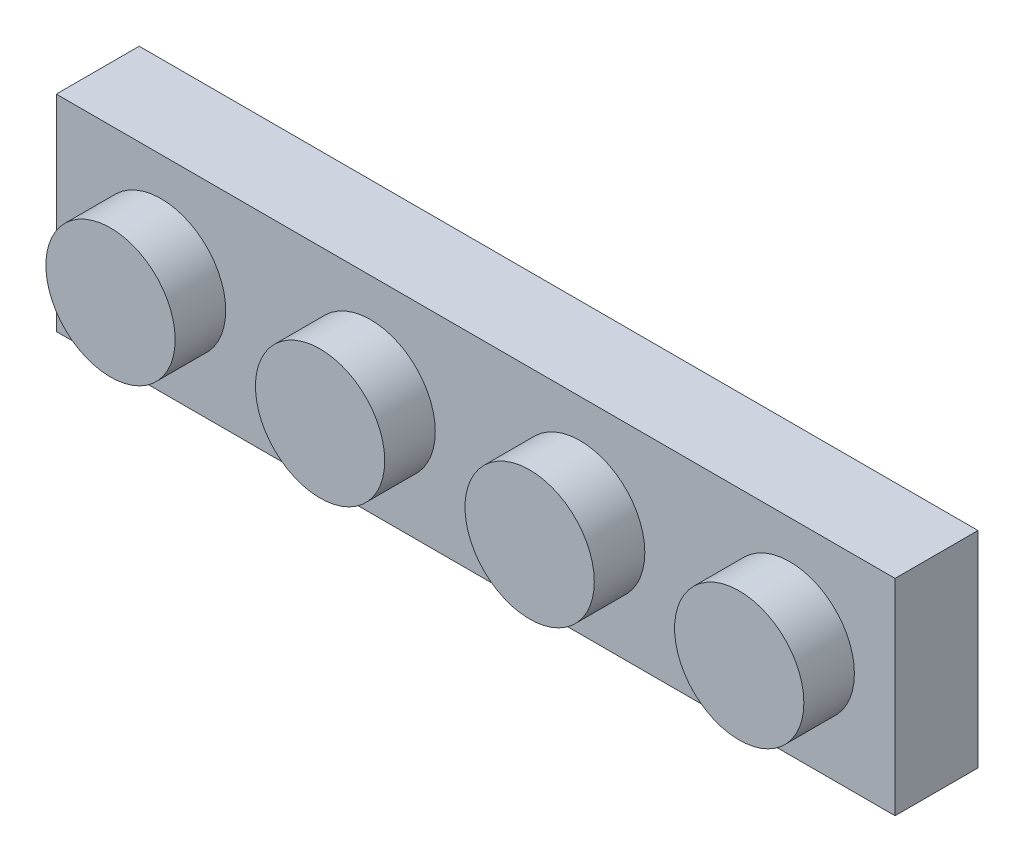
ISO-10303-21;
HEADER;
FILE_DESCRIPTION(('STEP AP214'),'2;1');
FILE_NAME('part.step','',(''),(''),'','','');
FILE_SCHEMA(('AUTOMOTIVE_DESIGN { 1 0 10303 214 1 1 1 1 }'));
ENDSEC;
DATA;
#1=APPLICATION_CONTEXT('core data for automotive mechanical design processes');
#2=APPLICATION_PROTOCOL_DEFINITION('international standard','automotive_design',2000,#1);
#3=PRODUCT_CONTEXT('',#1,'mechanical');
#4=PRODUCT('Part','Part','',(#3));
#5=PRODUCT_RELATED_PRODUCT_CATEGORY('part','',(#4));
#6=PRODUCT_DEFINITION_FORMATION('','',#4);
#7=PRODUCT_DEFINITION_CONTEXT('part definition',#1,'design');
#8=PRODUCT_DEFINITION('design','',#6,#7);
#9=PRODUCT_DEFINITION_SHAPE('','',#8);
#10=(LENGTH_UNIT() NAMED_UNIT(*) SI_UNIT(.MILLI.,.METRE.));
#11=(NAMED_UNIT(*) PLANE_ANGLE_UNIT() SI_UNIT($,.RADIAN.));
#12=(NAMED_UNIT(*) SI_UNIT($,.STERADIAN.) SOLID_ANGLE_UNIT());
#13=UNCERTAINTY_MEASURE_WITH_UNIT(LENGTH_MEASURE(1.E-05),#10,'distance_accuracy_value','');
#14=(GEOMETRIC_REPRESENTATION_CONTEXT(3) GLOBAL_UNCERTAINTY_ASSIGNED_CONTEXT((#13)) GLOBAL_UNIT_ASSIGNED_CONTEXT((#10,
#11,#12)) REPRESENTATION_CONTEXT('',''));
#15=CARTESIAN_POINT('',(0.,0.,0.));
#16=DIRECTION('',(0.,0.,1.));
#17=DIRECTION('',(1.,0.,0.));
#18=AXIS2_PLACEMENT_3D('',#15,#16,#17);
#19=CARTESIAN_POINT('',(15.93,3.905,-3.15));
#20=DIRECTION('',(1.,0.,0.));
#21=DIRECTION('',(0.,0.,-1.));
#22=AXIS2_PLACEMENT_3D('',#19,#20,#21);
#23=PLANE('',#22);
#24=DIRECTION('',(0.,1.,0.));
#25=VECTOR('',#24,1.);
#26=CARTESIAN_POINT('',(15.93,3.905,0.));
#27=LINE('',#26,#25);
#28=CARTESIAN_POINT('',(15.93,-3.905,0.));
#29=VERTEX_POINT('',#28);
#30=CARTESIAN_POINT('',(15.93,3.905,0.));
#31=VERTEX_POINT('',#30);
#32=EDGE_CURVE('E195',#29,#31,#27,.T.);
#33=ORIENTED_EDGE('',*,*,#32,.F.);
#34=DIRECTION('',(0.,0.,1.));
#35=VECTOR('',#34,1.);
#36=CARTESIAN_POINT('',(15.93,-3.905,-3.15));
#37=LINE('',#36,#35);
#38=CARTESIAN_POINT('',(15.93,-3.905,-3.15));
#39=VERTEX_POINT('',#38);
#40=EDGE_CURVE('E58',#39,#29,#37,.T.);
#41=ORIENTED_EDGE('',*,*,#40,.F.);
#42=DIRECTION('',(0.,1.,0.));
#43=VECTOR('',#42,1.);
#44=CARTESIAN_POINT('',(15.93,3.905,-3.15));
#45=LINE('',#44,#43);
#46=CARTESIAN_POINT('',(15.93,3.905,-3.15));
#47=VERTEX_POINT('',#46);
#48=EDGE_CURVE('E198',#39,#47,#45,.T.);
#49=ORIENTED_EDGE('',*,*,#48,.T.);
#50=DIRECTION('',(0.,0.,1.));
#51=VECTOR('',#50,1.);
#52=CARTESIAN_POINT('',(15.93,3.905,-3.15));
#53=LINE('',#52,#51);
#54=EDGE_CURVE('E84',#47,#31,#53,.T.);
#55=ORIENTED_EDGE('',*,*,#54,.T.);
#56=EDGE_LOOP('',(#33,#41,#49,#55));
#57=FACE_BOUND('',#56,.T.);
#58=ADVANCED_FACE('F35',(#57),#23,.T.);
#59=CARTESIAN_POINT('',(-15.93,-3.905,-3.15));
#60=DIRECTION('',(0.,-1.,0.));
#61=DIRECTION('',(0.,0.,-1.));
#62=AXIS2_PLACEMENT_3D('',#59,#60,#61);
#63=PLANE('',#62);
#64=DIRECTION('',(1.,0.,0.));
#65=VECTOR('',#64,1.);
#66=CARTESIAN_POINT('',(-15.93,-3.905,0.));
#67=LINE('',#66,#65);
#68=CARTESIAN_POINT('',(-15.93,-3.905,0.));
#69=VERTEX_POINT('',#68);
#70=EDGE_CURVE('E201',#69,#29,#67,.T.);
#71=ORIENTED_EDGE('',*,*,#70,.F.);
#72=DIRECTION('',(0.,0.,1.));
#73=VECTOR('',#72,1.);
#74=CARTESIAN_POINT('',(-15.93,-3.905,-3.15));
#75=LINE('',#74,#73);
#76=CARTESIAN_POINT('',(-15.93,-3.905,-3.15));
#77=VERTEX_POINT('',#76);
#78=EDGE_CURVE('E220',#77,#69,#75,.T.);
#79=ORIENTED_EDGE('',*,*,#78,.F.);
#80=DIRECTION('',(1.,0.,0.));
#81=VECTOR('',#80,1.);
#82=CARTESIAN_POINT('',(-15.93,-3.905,-3.15));
#83=LINE('',#82,#81);
#84=EDGE_CURVE('E206',#77,#39,#83,.T.);
#85=ORIENTED_EDGE('',*,*,#84,.T.);
#86=ORIENTED_EDGE('',*,*,#40,.T.);
#87=EDGE_LOOP('',(#71,#79,#85,#86));
#88=FACE_BOUND('',#87,.T.);
#89=ADVANCED_FACE('F260',(#88),#63,.T.);
#90=CARTESIAN_POINT('',(-15.93,3.905,-3.15));
#91=DIRECTION('',(-1.,0.,0.));
#92=DIRECTION('',(0.,0.,1.));
#93=AXIS2_PLACEMENT_3D('',#90,#91,#92);
#94=PLANE('',#93);
#95=DIRECTION('',(0.,-1.,0.));
#96=VECTOR('',#95,1.);
#97=CARTESIAN_POINT('',(-15.93,3.905,0.));
#98=LINE('',#97,#96);
#99=CARTESIAN_POINT('',(-15.93,3.905,0.));
#100=VERTEX_POINT('',#99);
#101=EDGE_CURVE('E213',#100,#69,#98,.T.);
#102=ORIENTED_EDGE('',*,*,#101,.F.);
#103=DIRECTION('',(0.,0.,1.));
#104=VECTOR('',#103,1.);
#105=CARTESIAN_POINT('',(-15.93,3.905,-3.15));
#106=LINE('',#105,#104);
#107=CARTESIAN_POINT('',(-15.93,3.905,-3.15));
#108=VERTEX_POINT('',#107);
#109=EDGE_CURVE('E222',#108,#100,#106,.T.);
#110=ORIENTED_EDGE('',*,*,#109,.F.);
#111=DIRECTION('',(0.,-1.,0.));
#112=VECTOR('',#111,1.);
#113=CARTESIAN_POINT('',(-15.93,3.905,-3.15));
#114=LINE('',#113,#112);
#115=EDGE_CURVE('E203',#108,#77,#114,.T.);
#116=ORIENTED_EDGE('',*,*,#115,.T.);
#117=ORIENTED_EDGE('',*,*,#78,.T.);
#118=EDGE_LOOP('',(#102,#110,#116,#117));
#119=FACE_BOUND('',#118,.T.);
#120=ADVANCED_FACE('F264',(#119),#94,.T.);
#121=CARTESIAN_POINT('',(-15.93,3.905,-3.15));
#122=DIRECTION('',(0.,1.,0.));
#123=DIRECTION('',(0.,0.,1.));
#124=AXIS2_PLACEMENT_3D('',#121,#122,#123);
#125=PLANE('',#124);
#126=DIRECTION('',(-1.,0.,0.));
#127=VECTOR('',#126,1.);
#128=CARTESIAN_POINT('',(-15.93,3.905,0.));
#129=LINE('',#128,#127);
#130=EDGE_CURVE('E210',#31,#100,#129,.T.);
#131=ORIENTED_EDGE('',*,*,#130,.F.);
#132=ORIENTED_EDGE('',*,*,#54,.F.);
#133=DIRECTION('',(-1.,0.,0.));
#134=VECTOR('',#133,1.);
#135=CARTESIAN_POINT('',(-15.93,3.905,-3.15));
#136=LINE('',#135,#134);
#137=EDGE_CURVE('E200',#47,#108,#136,.T.);
#138=ORIENTED_EDGE('',*,*,#137,.T.);
#139=ORIENTED_EDGE('',*,*,#109,.T.);
#140=EDGE_LOOP('',(#131,#132,#138,#139));
#141=FACE_BOUND('',#140,.T.);
#142=ADVANCED_FACE('F274',(#141),#125,.T.);
#143=CARTESIAN_POINT('',(0.,0.,-3.15));
#144=DIRECTION('',(0.,0.,1.));
#145=DIRECTION('',(1.,0.,0.));
#146=AXIS2_PLACEMENT_3D('',#143,#144,#145);
#147=PLANE('',#146);
#148=DIRECTION('',(1.,0.,0.));
#149=VECTOR('',#148,1.);
#150=CARTESIAN_POINT('',(0.,-2.405,-3.15));
#151=LINE('',#150,#149);
#152=CARTESIAN_POINT('',(-14.43,-2.405,-3.15));
#153=VERTEX_POINT('',#152);
#154=CARTESIAN_POINT('',(14.43,-2.405,-3.15));
#155=VERTEX_POINT('',#154);
#156=EDGE_CURVE('E169',#153,#155,#151,.T.);
#157=ORIENTED_EDGE('',*,*,#156,.T.);
#158=DIRECTION('',(0.,1.,0.));
#159=VECTOR('',#158,1.);
#160=CARTESIAN_POINT('',(14.43,0.,-3.15));
#161=LINE('',#160,#159);
#162=CARTESIAN_POINT('',(14.43,2.405,-3.15));
#163=VERTEX_POINT('',#162);
#164=EDGE_CURVE('E113',#155,#163,#161,.T.);
#165=ORIENTED_EDGE('',*,*,#164,.T.);
#166=DIRECTION('',(-1.,0.,0.));
#167=VECTOR('',#166,1.);
#168=CARTESIAN_POINT('',(0.,2.405,-3.15));
#169=LINE('',#168,#167);
#170=CARTESIAN_POINT('',(-14.43,2.405,-3.15));
#171=VERTEX_POINT('',#170);
#172=EDGE_CURVE('E135',#163,#171,#169,.T.);
#173=ORIENTED_EDGE('',*,*,#172,.T.);
#174=DIRECTION('',(0.,-1.,0.));
#175=VECTOR('',#174,1.);
#176=CARTESIAN_POINT('',(-14.43,0.,-3.15));
#177=LINE('',#176,#175);
#178=EDGE_CURVE('E49',#171,#153,#177,.T.);
#179=ORIENTED_EDGE('',*,*,#178,.T.);
#180=EDGE_LOOP('',(#157,#165,#173,#179));
#181=FACE_BOUND('',#180,.T.);
#182=ORIENTED_EDGE('',*,*,#48,.F.);
#183=ORIENTED_EDGE('',*,*,#84,.F.);
#184=ORIENTED_EDGE('',*,*,#115,.F.);
#185=ORIENTED_EDGE('',*,*,#137,.F.);
#186=EDGE_LOOP('',(#182,#183,#184,#185));
#187=FACE_BOUND('',#186,.T.);
#188=ADVANCED_FACE('F273',(#181,#187),#147,.F.);
#189=CARTESIAN_POINT('',(0.,0.,0.));
#190=DIRECTION('',(0.,0.,1.));
#191=DIRECTION('',(1.,0.,0.));
#192=AXIS2_PLACEMENT_3D('',#189,#190,#191);
#193=PLANE('',#192);
#194=CARTESIAN_POINT('',(11.93,0.,0.));
#195=DIRECTION('',(0.,0.,1.));
#196=DIRECTION('',(1.,0.,0.));
#197=AXIS2_PLACEMENT_3D('',#194,#195,#196);
#198=CIRCLE('',#197,2.455);
#199=CARTESIAN_POINT('',(14.385,0.,0.));
#200=VERTEX_POINT('',#199);
#201=EDGE_CURVE('E118',#200,#200,#198,.T.);
#202=ORIENTED_EDGE('',*,*,#201,.F.);
#203=EDGE_LOOP('',(#202));
#204=FACE_BOUND('',#203,.T.);
#205=CARTESIAN_POINT('',(3.97,0.,0.));
#206=DIRECTION('',(0.,0.,1.));
#207=DIRECTION('',(1.,0.,0.));
#208=AXIS2_PLACEMENT_3D('',#205,#206,#207);
#209=CIRCLE('',#208,2.455);
#210=CARTESIAN_POINT('',(6.425,0.,0.));
#211=VERTEX_POINT('',#210);
#212=EDGE_CURVE('E177',#211,#211,#209,.T.);
#213=ORIENTED_EDGE('',*,*,#212,.F.);
#214=EDGE_LOOP('',(#213));
#215=FACE_BOUND('',#214,.T.);
#216=CARTESIAN_POINT('',(-3.99,0.,0.));
#217=DIRECTION('',(0.,0.,1.));
#218=DIRECTION('',(1.,0.,0.));
#219=AXIS2_PLACEMENT_3D('',#216,#217,#218);
#220=CIRCLE('',#219,2.455);
#221=CARTESIAN_POINT('',(-1.535,0.,0.));
#222=VERTEX_POINT('',#221);
#223=EDGE_CURVE('E183',#222,#222,#220,.T.);
#224=ORIENTED_EDGE('',*,*,#223,.F.);
#225=EDGE_LOOP('',(#224));
#226=FACE_BOUND('',#225,.T.);
#227=CARTESIAN_POINT('',(-11.95,0.,0.));
#228=DIRECTION('',(0.,0.,1.));
#229=DIRECTION('',(1.,0.,0.));
#230=AXIS2_PLACEMENT_3D('',#227,#228,#229);
#231=CIRCLE('',#230,2.455);
#232=CARTESIAN_POINT('',(-9.495,0.,0.));
#233=VERTEX_POINT('',#232);
#234=EDGE_CURVE('E189',#233,#233,#231,.T.);
#235=ORIENTED_EDGE('',*,*,#234,.F.);
#236=EDGE_LOOP('',(#235));
#237=FACE_BOUND('',#236,.T.);
#238=ORIENTED_EDGE('',*,*,#32,.T.);
#239=ORIENTED_EDGE('',*,*,#130,.T.);
#240=ORIENTED_EDGE('',*,*,#101,.T.);
#241=ORIENTED_EDGE('',*,*,#70,.T.);
#242=EDGE_LOOP('',(#238,#239,#240,#241));
#243=FACE_BOUND('',#242,.T.);
#244=ADVANCED_FACE('F267',(#204,#215,#226,#237,#243),#193,.T.);
#245=CARTESIAN_POINT('',(-11.95,0.,1.92));
#246=DIRECTION('',(0.,0.,-1.));
#247=DIRECTION('',(-1.,0.,0.));
#248=AXIS2_PLACEMENT_3D('',#245,#246,#247);
#249=CYLINDRICAL_SURFACE('',#248,2.455);
#250=CARTESIAN_POINT('',(-11.95,0.,1.92));
#251=DIRECTION('',(0.,0.,1.));
#252=DIRECTION('',(1.,0.,0.));
#253=AXIS2_PLACEMENT_3D('',#250,#251,#252);
#254=CIRCLE('',#253,2.455);
#255=CARTESIAN_POINT('',(-9.495,0.,1.92));
#256=VERTEX_POINT('',#255);
#257=EDGE_CURVE('E192',#256,#256,#254,.T.);
#258=ORIENTED_EDGE('',*,*,#257,.F.);
#259=EDGE_LOOP('',(#258));
#260=FACE_BOUND('',#259,.T.);
#261=ORIENTED_EDGE('',*,*,#234,.T.);
#262=EDGE_LOOP('',(#261));
#263=FACE_BOUND('',#262,.T.);
#264=ADVANCED_FACE('F285',(#260,#263),#249,.T.);
#265=CARTESIAN_POINT('',(-11.95,0.,1.92));
#266=DIRECTION('',(0.,0.,1.));
#267=DIRECTION('',(1.,0.,0.));
#268=AXIS2_PLACEMENT_3D('',#265,#266,#267);
#269=PLANE('',#268);
#270=ORIENTED_EDGE('',*,*,#257,.T.);
#271=EDGE_LOOP('',(#270));
#272=FACE_BOUND('',#271,.T.);
#273=ADVANCED_FACE('F290',(#272),#269,.T.);
#274=CARTESIAN_POINT('',(-3.99,0.,1.92));
#275=DIRECTION('',(0.,0.,-1.));
#276=DIRECTION('',(-1.,0.,0.));
#277=AXIS2_PLACEMENT_3D('',#274,#275,#276);
#278=CYLINDRICAL_SURFACE('',#277,2.455);
#279=CARTESIAN_POINT('',(-3.99,0.,1.92));
#280=DIRECTION('',(0.,0.,1.));
#281=DIRECTION('',(1.,0.,0.));
#282=AXIS2_PLACEMENT_3D('',#279,#280,#281);
#283=CIRCLE('',#282,2.455);
#284=CARTESIAN_POINT('',(-1.535,0.,1.92));
#285=VERTEX_POINT('',#284);
#286=EDGE_CURVE('E186',#285,#285,#283,.T.);
#287=ORIENTED_EDGE('',*,*,#286,.F.);
#288=EDGE_LOOP('',(#287));
#289=FACE_BOUND('',#288,.T.);
#290=ORIENTED_EDGE('',*,*,#223,.T.);
#291=EDGE_LOOP('',(#290));
#292=FACE_BOUND('',#291,.T.);
#293=ADVANCED_FACE('F294',(#289,#292),#278,.T.);
#294=CARTESIAN_POINT('',(-3.99,0.,1.92));
#295=DIRECTION('',(0.,0.,1.));
#296=DIRECTION('',(1.,0.,0.));
#297=AXIS2_PLACEMENT_3D('',#294,#295,#296);
#298=PLANE('',#297);
#299=ORIENTED_EDGE('',*,*,#286,.T.);
#300=EDGE_LOOP('',(#299));
#301=FACE_BOUND('',#300,.T.);
#302=ADVANCED_FACE('F298',(#301),#298,.T.);
#303=CARTESIAN_POINT('',(3.97,0.,1.92));
#304=DIRECTION('',(0.,0.,-1.));
#305=DIRECTION('',(-1.,0.,0.));
#306=AXIS2_PLACEMENT_3D('',#303,#304,#305);
#307=CYLINDRICAL_SURFACE('',#306,2.455);
#308=CARTESIAN_POINT('',(3.97,0.,1.92));
#309=DIRECTION('',(0.,0.,1.));
#310=DIRECTION('',(1.,0.,0.));
#311=AXIS2_PLACEMENT_3D('',#308,#309,#310);
#312=CIRCLE('',#311,2.455);
#313=CARTESIAN_POINT('',(6.425,0.,1.92));
#314=VERTEX_POINT('',#313);
#315=EDGE_CURVE('E180',#314,#314,#312,.T.);
#316=ORIENTED_EDGE('',*,*,#315,.F.);
#317=EDGE_LOOP('',(#316));
#318=FACE_BOUND('',#317,.T.);
#319=ORIENTED_EDGE('',*,*,#212,.T.);
#320=EDGE_LOOP('',(#319));
#321=FACE_BOUND('',#320,.T.);
#322=ADVANCED_FACE('F302',(#318,#321),#307,.T.);
#323=CARTESIAN_POINT('',(3.97,0.,1.92));
#324=DIRECTION('',(0.,0.,1.));
#325=DIRECTION('',(1.,0.,0.));
#326=AXIS2_PLACEMENT_3D('',#323,#324,#325);
#327=PLANE('',#326);
#328=ORIENTED_EDGE('',*,*,#315,.T.);
#329=EDGE_LOOP('',(#328));
#330=FACE_BOUND('',#329,.T.);
#331=ADVANCED_FACE('F306',(#330),#327,.T.);
#332=CARTESIAN_POINT('',(11.93,0.,1.92));
#333=DIRECTION('',(0.,0.,-1.));
#334=DIRECTION('',(-1.,0.,0.));
#335=AXIS2_PLACEMENT_3D('',#332,#333,#334);
#336=CYLINDRICAL_SURFACE('',#335,2.455);
#337=CARTESIAN_POINT('',(11.93,0.,1.92));
#338=DIRECTION('',(0.,0.,1.));
#339=DIRECTION('',(1.,0.,0.));
#340=AXIS2_PLACEMENT_3D('',#337,#338,#339);
#341=CIRCLE('',#340,2.455);
#342=CARTESIAN_POINT('',(14.385,0.,1.92));
#343=VERTEX_POINT('',#342);
#344=EDGE_CURVE('E174',#343,#343,#341,.T.);
#345=ORIENTED_EDGE('',*,*,#344,.F.);
#346=EDGE_LOOP('',(#345));
#347=FACE_BOUND('',#346,.T.);
#348=ORIENTED_EDGE('',*,*,#201,.T.);
#349=EDGE_LOOP('',(#348));
#350=FACE_BOUND('',#349,.T.);
#351=ADVANCED_FACE('F310',(#347,#350),#336,.T.);
#352=CARTESIAN_POINT('',(11.93,0.,1.92));
#353=DIRECTION('',(0.,0.,1.));
#354=DIRECTION('',(1.,0.,0.));
#355=AXIS2_PLACEMENT_3D('',#352,#353,#354);
#356=PLANE('',#355);
#357=ORIENTED_EDGE('',*,*,#344,.T.);
#358=EDGE_LOOP('',(#357));
#359=FACE_BOUND('',#358,.T.);
#360=ADVANCED_FACE('F314',(#359),#356,.T.);
#361=CARTESIAN_POINT('',(14.43,3.905,-3.15));
#362=DIRECTION('',(1.,0.,0.));
#363=DIRECTION('',(0.,0.,-1.));
#364=AXIS2_PLACEMENT_3D('',#361,#362,#363);
#365=PLANE('',#364);
#366=DIRECTION('',(0.,1.,0.));
#367=VECTOR('',#366,1.);
#368=CARTESIAN_POINT('',(14.43,0.,-1.5));
#369=LINE('',#368,#367);
#370=CARTESIAN_POINT('',(14.43,-2.405,-1.5));
#371=VERTEX_POINT('',#370);
#372=CARTESIAN_POINT('',(14.43,2.405,-1.5));
#373=VERTEX_POINT('',#372);
#374=EDGE_CURVE('E111',#371,#373,#369,.T.);
#375=ORIENTED_EDGE('',*,*,#374,.T.);
#376=DIRECTION('',(0.,0.,1.));
#377=VECTOR('',#376,1.);
#378=CARTESIAN_POINT('',(14.43,2.405,-3.15));
#379=LINE('',#378,#377);
#380=EDGE_CURVE('E140',#163,#373,#379,.T.);
#381=ORIENTED_EDGE('',*,*,#380,.F.);
#382=ORIENTED_EDGE('',*,*,#164,.F.);
#383=DIRECTION('',(0.,0.,1.));
#384=VECTOR('',#383,1.);
#385=CARTESIAN_POINT('',(14.43,-2.405,-3.15));
#386=LINE('',#385,#384);
#387=EDGE_CURVE('E108',#155,#371,#386,.T.);
#388=ORIENTED_EDGE('',*,*,#387,.T.);
#389=EDGE_LOOP('',(#375,#381,#382,#388));
#390=FACE_BOUND('',#389,.T.);
#391=ADVANCED_FACE('F110',(#390),#365,.F.);
#392=CARTESIAN_POINT('',(-15.93,-2.405,-3.15));
#393=DIRECTION('',(0.,-1.,0.));
#394=DIRECTION('',(0.,0.,-1.));
#395=AXIS2_PLACEMENT_3D('',#392,#393,#394);
#396=PLANE('',#395);
#397=DIRECTION('',(1.,0.,0.));
#398=VECTOR('',#397,1.);
#399=CARTESIAN_POINT('',(0.,-2.405,-1.5));
#400=LINE('',#399,#398);
#401=CARTESIAN_POINT('',(-14.43,-2.405,-1.5));
#402=VERTEX_POINT('',#401);
#403=EDGE_CURVE('E126',#402,#371,#400,.T.);
#404=ORIENTED_EDGE('',*,*,#403,.T.);
#405=ORIENTED_EDGE('',*,*,#387,.F.);
#406=ORIENTED_EDGE('',*,*,#156,.F.);
#407=DIRECTION('',(0.,0.,1.));
#408=VECTOR('',#407,1.);
#409=CARTESIAN_POINT('',(-14.43,-2.405,-3.15));
#410=LINE('',#409,#408);
#411=EDGE_CURVE('E119',#153,#402,#410,.T.);
#412=ORIENTED_EDGE('',*,*,#411,.T.);
#413=EDGE_LOOP('',(#404,#405,#406,#412));
#414=FACE_BOUND('',#413,.T.);
#415=ADVANCED_FACE('F131',(#414),#396,.F.);
#416=CARTESIAN_POINT('',(-14.43,3.905,-3.15));
#417=DIRECTION('',(-1.,0.,0.));
#418=DIRECTION('',(0.,0.,1.));
#419=AXIS2_PLACEMENT_3D('',#416,#417,#418);
#420=PLANE('',#419);
#421=DIRECTION('',(0.,-1.,0.));
#422=VECTOR('',#421,1.);
#423=CARTESIAN_POINT('',(-14.43,0.,-1.5));
#424=LINE('',#423,#422);
#425=CARTESIAN_POINT('',(-14.43,2.405,-1.5));
#426=VERTEX_POINT('',#425);
#427=EDGE_CURVE('E133',#426,#402,#424,.T.);
#428=ORIENTED_EDGE('',*,*,#427,.T.);
#429=ORIENTED_EDGE('',*,*,#411,.F.);
#430=ORIENTED_EDGE('',*,*,#178,.F.);
#431=DIRECTION('',(0.,0.,1.));
#432=VECTOR('',#431,1.);
#433=CARTESIAN_POINT('',(-14.43,2.405,-3.15));
#434=LINE('',#433,#432);
#435=EDGE_CURVE('E141',#171,#426,#434,.T.);
#436=ORIENTED_EDGE('',*,*,#435,.T.);
#437=EDGE_LOOP('',(#428,#429,#430,#436));
#438=FACE_BOUND('',#437,.T.);
#439=ADVANCED_FACE('F514',(#438),#420,.F.);
#440=CARTESIAN_POINT('',(-15.93,2.405,-3.15));
#441=DIRECTION('',(0.,1.,0.));
#442=DIRECTION('',(0.,0.,1.));
#443=AXIS2_PLACEMENT_3D('',#440,#441,#442);
#444=PLANE('',#443);
#445=DIRECTION('',(-1.,0.,0.));
#446=VECTOR('',#445,1.);
#447=CARTESIAN_POINT('',(0.,2.405,-1.5));
#448=LINE('',#447,#446);
#449=EDGE_CURVE('E128',#373,#426,#448,.T.);
#450=ORIENTED_EDGE('',*,*,#449,.T.);
#451=ORIENTED_EDGE('',*,*,#435,.F.);
#452=ORIENTED_EDGE('',*,*,#172,.F.);
#453=ORIENTED_EDGE('',*,*,#380,.T.);
#454=EDGE_LOOP('',(#450,#451,#452,#453));
#455=FACE_BOUND('',#454,.T.);
#456=ADVANCED_FACE('F234',(#455),#444,.F.);
#457=CARTESIAN_POINT('',(0.,0.,-1.5));
#458=DIRECTION('',(0.,0.,1.));
#459=DIRECTION('',(1.,0.,0.));
#460=AXIS2_PLACEMENT_3D('',#457,#458,#459);
#461=PLANE('',#460);
#462=CARTESIAN_POINT('',(-7.975,0.,-1.5));
#463=DIRECTION('',(0.,0.,1.));
#464=DIRECTION('',(1.,0.,0.));
#465=AXIS2_PLACEMENT_3D('',#462,#463,#464);
#466=CIRCLE('',#465,1.485);
#467=CARTESIAN_POINT('',(-6.49,0.,-1.5));
#468=VERTEX_POINT('',#467);
#469=EDGE_CURVE('E12',#468,#468,#466,.F.);
#470=ORIENTED_EDGE('',*,*,#469,.F.);
#471=EDGE_LOOP('',(#470));
#472=FACE_BOUND('',#471,.T.);
#473=CARTESIAN_POINT('',(-0.0049999999999998,0.,-1.5));
#474=DIRECTION('',(0.,0.,1.));
#475=DIRECTION('',(1.,0.,0.));
#476=AXIS2_PLACEMENT_3D('',#473,#474,#475);
#477=CIRCLE('',#476,1.485);
#478=CARTESIAN_POINT('',(1.48,0.,-1.5));
#479=VERTEX_POINT('',#478);
#480=EDGE_CURVE('E42',#479,#479,#477,.F.);
#481=ORIENTED_EDGE('',*,*,#480,.F.);
#482=EDGE_LOOP('',(#481));
#483=FACE_BOUND('',#482,.T.);
#484=CARTESIAN_POINT('',(7.965,0.,-1.5));
#485=DIRECTION('',(0.,0.,1.));
#486=DIRECTION('',(1.,0.,0.));
#487=AXIS2_PLACEMENT_3D('',#484,#485,#486);
#488=CIRCLE('',#487,1.485);
#489=CARTESIAN_POINT('',(9.45,0.,-1.5));
#490=VERTEX_POINT('',#489);
#491=EDGE_CURVE('E219',#490,#490,#488,.F.);
#492=ORIENTED_EDGE('',*,*,#491,.F.);
#493=EDGE_LOOP('',(#492));
#494=FACE_BOUND('',#493,.T.);
#495=CARTESIAN_POINT('',(11.93,0.,-1.5));
#496=DIRECTION('',(0.,0.,1.));
#497=DIRECTION('',(1.,0.,0.));
#498=AXIS2_PLACEMENT_3D('',#495,#496,#497);
#499=CIRCLE('',#498,0.955);
#500=CARTESIAN_POINT('',(12.885,0.,-1.5));
#501=VERTEX_POINT('',#500);
#502=EDGE_CURVE('E145',#501,#501,#499,.T.);
#503=ORIENTED_EDGE('',*,*,#502,.T.);
#504=EDGE_LOOP('',(#503));
#505=FACE_BOUND('',#504,.T.);
#506=CARTESIAN_POINT('',(3.97,0.,-1.5));
#507=DIRECTION('',(0.,0.,1.));
#508=DIRECTION('',(1.,0.,0.));
#509=AXIS2_PLACEMENT_3D('',#506,#507,#508);
#510=CIRCLE('',#509,0.955);
#511=CARTESIAN_POINT('',(4.925,0.,-1.5));
#512=VERTEX_POINT('',#511);
#513=EDGE_CURVE('E150',#512,#512,#510,.T.);
#514=ORIENTED_EDGE('',*,*,#513,.T.);
#515=EDGE_LOOP('',(#514));
#516=FACE_BOUND('',#515,.T.);
#517=CARTESIAN_POINT('',(-3.99,0.,-1.5));
#518=DIRECTION('',(0.,0.,1.));
#519=DIRECTION('',(1.,0.,0.));
#520=AXIS2_PLACEMENT_3D('',#517,#518,#519);
#521=CIRCLE('',#520,0.955);
#522=CARTESIAN_POINT('',(-3.035,0.,-1.5));
#523=VERTEX_POINT('',#522);
#524=EDGE_CURVE('E154',#523,#523,#521,.T.);
#525=ORIENTED_EDGE('',*,*,#524,.T.);
#526=EDGE_LOOP('',(#525));
#527=FACE_BOUND('',#526,.T.);
#528=CARTESIAN_POINT('',(-11.95,0.,-1.5));
#529=DIRECTION('',(0.,0.,1.));
#530=DIRECTION('',(1.,0.,0.));
#531=AXIS2_PLACEMENT_3D('',#528,#529,#530);
#532=CIRCLE('',#531,0.955);
#533=CARTESIAN_POINT('',(-10.995,0.,-1.5));
#534=VERTEX_POINT('',#533);
#535=EDGE_CURVE('E158',#534,#534,#532,.T.);
#536=ORIENTED_EDGE('',*,*,#535,.T.);
#537=EDGE_LOOP('',(#536));
#538=FACE_BOUND('',#537,.T.);
#539=ORIENTED_EDGE('',*,*,#374,.F.);
#540=ORIENTED_EDGE('',*,*,#403,.F.);
#541=ORIENTED_EDGE('',*,*,#427,.F.);
#542=ORIENTED_EDGE('',*,*,#449,.F.);
#543=EDGE_LOOP('',(#539,#540,#541,#542));
#544=FACE_BOUND('',#543,.T.);
#545=ADVANCED_FACE('F124',(#472,#483,#494,#505,#516,#527,#538,#544),#461,.F.);
#546=CARTESIAN_POINT('',(-11.95,0.,1.92));
#547=DIRECTION('',(0.,0.,-1.));
#548=DIRECTION('',(-1.,0.,0.));
#549=AXIS2_PLACEMENT_3D('',#546,#547,#548);
#550=CYLINDRICAL_SURFACE('',#549,0.955);
#551=CARTESIAN_POINT('',(-11.95,0.,0.42));
#552=DIRECTION('',(0.,0.,1.));
#553=DIRECTION('',(1.,0.,0.));
#554=AXIS2_PLACEMENT_3D('',#551,#552,#553);
#555=CIRCLE('',#554,0.955);
#556=CARTESIAN_POINT('',(-10.995,0.,0.42));
#557=VERTEX_POINT('',#556);
#558=EDGE_CURVE('E129',#557,#557,#555,.T.);
#559=ORIENTED_EDGE('',*,*,#558,.T.);
#560=EDGE_LOOP('',(#559));
#561=FACE_BOUND('',#560,.T.);
#562=ORIENTED_EDGE('',*,*,#535,.F.);
#563=EDGE_LOOP('',(#562));
#564=FACE_BOUND('',#563,.T.);
#565=ADVANCED_FACE('F233',(#561,#564),#550,.F.);
#566=CARTESIAN_POINT('',(-11.95,0.,0.42));
#567=DIRECTION('',(0.,0.,1.));
#568=DIRECTION('',(1.,0.,0.));
#569=AXIS2_PLACEMENT_3D('',#566,#567,#568);
#570=PLANE('',#569);
#571=ORIENTED_EDGE('',*,*,#558,.F.);
#572=EDGE_LOOP('',(#571));
#573=FACE_BOUND('',#572,.T.);
#574=ADVANCED_FACE('F250',(#573),#570,.F.);
#575=CARTESIAN_POINT('',(-3.99,0.,1.92));
#576=DIRECTION('',(0.,0.,-1.));
#577=DIRECTION('',(-1.,0.,0.));
#578=AXIS2_PLACEMENT_3D('',#575,#576,#577);
#579=CYLINDRICAL_SURFACE('',#578,0.955);
#580=CARTESIAN_POINT('',(-3.99,0.,0.42));
#581=DIRECTION('',(0.,0.,1.));
#582=DIRECTION('',(1.,0.,0.));
#583=AXIS2_PLACEMENT_3D('',#580,#581,#582);
#584=CIRCLE('',#583,0.955);
#585=CARTESIAN_POINT('',(-3.035,0.,0.42));
#586=VERTEX_POINT('',#585);
#587=EDGE_CURVE('E157',#586,#586,#584,.T.);
#588=ORIENTED_EDGE('',*,*,#587,.T.);
#589=EDGE_LOOP('',(#588));
#590=FACE_BOUND('',#589,.T.);
#591=ORIENTED_EDGE('',*,*,#524,.F.);
#592=EDGE_LOOP('',(#591));
#593=FACE_BOUND('',#592,.T.);
#594=ADVANCED_FACE('F256',(#590,#593),#579,.F.);
#595=CARTESIAN_POINT('',(-3.99,0.,0.42));
#596=DIRECTION('',(0.,0.,1.));
#597=DIRECTION('',(1.,0.,0.));
#598=AXIS2_PLACEMENT_3D('',#595,#596,#597);
#599=PLANE('',#598);
#600=ORIENTED_EDGE('',*,*,#587,.F.);
#601=EDGE_LOOP('',(#600));
#602=FACE_BOUND('',#601,.T.);
#603=ADVANCED_FACE('F335',(#602),#599,.F.);
#604=CARTESIAN_POINT('',(3.97,0.,1.92));
#605=DIRECTION('',(0.,0.,-1.));
#606=DIRECTION('',(-1.,0.,0.));
#607=AXIS2_PLACEMENT_3D('',#604,#605,#606);
#608=CYLINDRICAL_SURFACE('',#607,0.955);
#609=CARTESIAN_POINT('',(3.97,0.,0.42));
#610=DIRECTION('',(0.,0.,1.));
#611=DIRECTION('',(1.,0.,0.));
#612=AXIS2_PLACEMENT_3D('',#609,#610,#611);
#613=CIRCLE('',#612,0.955);
#614=CARTESIAN_POINT('',(4.925,0.,0.42));
#615=VERTEX_POINT('',#614);
#616=EDGE_CURVE('E153',#615,#615,#613,.T.);
#617=ORIENTED_EDGE('',*,*,#616,.T.);
#618=EDGE_LOOP('',(#617));
#619=FACE_BOUND('',#618,.T.);
#620=ORIENTED_EDGE('',*,*,#513,.F.);
#621=EDGE_LOOP('',(#620));
#622=FACE_BOUND('',#621,.T.);
#623=ADVANCED_FACE('F331',(#619,#622),#608,.F.);
#624=CARTESIAN_POINT('',(3.97,0.,0.42));
#625=DIRECTION('',(0.,0.,1.));
#626=DIRECTION('',(1.,0.,0.));
#627=AXIS2_PLACEMENT_3D('',#624,#625,#626);
#628=PLANE('',#627);
#629=ORIENTED_EDGE('',*,*,#616,.F.);
#630=EDGE_LOOP('',(#629));
#631=FACE_BOUND('',#630,.T.);
#632=ADVANCED_FACE('F327',(#631),#628,.F.);
#633=CARTESIAN_POINT('',(11.93,0.,1.92));
#634=DIRECTION('',(0.,0.,-1.));
#635=DIRECTION('',(-1.,0.,0.));
#636=AXIS2_PLACEMENT_3D('',#633,#634,#635);
#637=CYLINDRICAL_SURFACE('',#636,0.955);
#638=CARTESIAN_POINT('',(11.93,0.,0.42));
#639=DIRECTION('',(0.,0.,1.));
#640=DIRECTION('',(1.,0.,0.));
#641=AXIS2_PLACEMENT_3D('',#638,#639,#640);
#642=CIRCLE('',#641,0.955);
#643=CARTESIAN_POINT('',(12.885,0.,0.42));
#644=VERTEX_POINT('',#643);
#645=EDGE_CURVE('E148',#644,#644,#642,.T.);
#646=ORIENTED_EDGE('',*,*,#645,.T.);
#647=EDGE_LOOP('',(#646));
#648=FACE_BOUND('',#647,.T.);
#649=ORIENTED_EDGE('',*,*,#502,.F.);
#650=EDGE_LOOP('',(#649));
#651=FACE_BOUND('',#650,.T.);
#652=ADVANCED_FACE('F323',(#648,#651),#637,.F.);
#653=CARTESIAN_POINT('',(11.93,0.,0.42));
#654=DIRECTION('',(0.,0.,1.));
#655=DIRECTION('',(1.,0.,0.));
#656=AXIS2_PLACEMENT_3D('',#653,#654,#655);
#657=PLANE('',#656);
#658=ORIENTED_EDGE('',*,*,#645,.F.);
#659=EDGE_LOOP('',(#658));
#660=FACE_BOUND('',#659,.T.);
#661=ADVANCED_FACE('F319',(#660),#657,.F.);
#662=CARTESIAN_POINT('',(7.965,0.,-7.35021428024809));
#663=DIRECTION('',(0.,0.,1.));
#664=DIRECTION('',(1.,0.,0.));
#665=AXIS2_PLACEMENT_3D('',#662,#663,#664);
#666=CYLINDRICAL_SURFACE('',#665,1.485);
#667=CARTESIAN_POINT('',(7.965,0.,-2.95));
#668=DIRECTION('',(0.,0.,1.));
#669=DIRECTION('',(1.,0.,0.));
#670=AXIS2_PLACEMENT_3D('',#667,#668,#669);
#671=CIRCLE('',#670,1.485);
#672=CARTESIAN_POINT('',(9.45,0.,-2.95));
#673=VERTEX_POINT('',#672);
#674=EDGE_CURVE('E648',#673,#673,#671,.T.);
#675=ORIENTED_EDGE('',*,*,#674,.T.);
#676=EDGE_LOOP('',(#675));
#677=FACE_BOUND('',#676,.T.);
#678=ORIENTED_EDGE('',*,*,#491,.T.);
#679=EDGE_LOOP('',(#678));
#680=FACE_BOUND('',#679,.T.);
#681=ADVANCED_FACE('F322',(#677,#680),#666,.T.);
#682=CARTESIAN_POINT('',(7.965,0.,-7.35021428024809));
#683=DIRECTION('',(0.,0.,1.));
#684=DIRECTION('',(1.,0.,0.));
#685=AXIS2_PLACEMENT_3D('',#682,#683,#684);
#686=CYLINDRICAL_SURFACE('',#685,0.565000000000001);
#687=CARTESIAN_POINT('',(7.965,0.,-2.95));
#688=DIRECTION('',(0.,0.,1.));
#689=DIRECTION('',(1.,0.,0.));
#690=AXIS2_PLACEMENT_3D('',#687,#688,#689);
#691=CIRCLE('',#690,0.565000000000001);
#692=CARTESIAN_POINT('',(8.53,0.,-2.95));
#693=VERTEX_POINT('',#692);
#694=EDGE_CURVE('E149',#693,#693,#691,.T.);
#695=ORIENTED_EDGE('',*,*,#694,.F.);
#696=EDGE_LOOP('',(#695));
#697=FACE_BOUND('',#696,.T.);
#698=CARTESIAN_POINT('',(7.965,0.,-1.5));
#699=DIRECTION('',(0.,0.,-1.));
#700=DIRECTION('',(-1.,0.,0.));
#701=AXIS2_PLACEMENT_3D('',#698,#699,#700);
#702=CIRCLE('',#701,0.565000000000001);
#703=CARTESIAN_POINT('',(7.4,0.,-1.5));
#704=VERTEX_POINT('',#703);
#705=EDGE_CURVE('E645',#704,#704,#702,.T.);
#706=ORIENTED_EDGE('',*,*,#705,.F.);
#707=EDGE_LOOP('',(#706));
#708=FACE_BOUND('',#707,.T.);
#709=ADVANCED_FACE('F375',(#697,#708),#686,.F.);
#710=CARTESIAN_POINT('',(0.,0.,-2.95));
#711=DIRECTION('',(0.,0.,1.));
#712=DIRECTION('',(1.,0.,0.));
#713=AXIS2_PLACEMENT_3D('',#710,#711,#712);
#714=PLANE('',#713);
#715=ORIENTED_EDGE('',*,*,#694,.T.);
#716=EDGE_LOOP('',(#715));
#717=FACE_BOUND('',#716,.T.);
#718=ORIENTED_EDGE('',*,*,#674,.F.);
#719=EDGE_LOOP('',(#718));
#720=FACE_BOUND('',#719,.T.);
#721=ADVANCED_FACE('F383',(#717,#720),#714,.F.);
#722=ORIENTED_EDGE('',*,*,#705,.T.);
#723=EDGE_LOOP('',(#722));
#724=FACE_BOUND('',#723,.T.);
#725=ADVANCED_FACE('F238',(#724),#461,.F.);
#726=CARTESIAN_POINT('',(-0.0049999999999998,0.,-7.35021428024809));
#727=DIRECTION('',(0.,0.,1.));
#728=DIRECTION('',(1.,0.,0.));
#729=AXIS2_PLACEMENT_3D('',#726,#727,#728);
#730=CYLINDRICAL_SURFACE('',#729,1.485);
#731=CARTESIAN_POINT('',(-0.0049999999999998,0.,-2.95));
#732=DIRECTION('',(0.,0.,1.));
#733=DIRECTION('',(1.,0.,0.));
#734=AXIS2_PLACEMENT_3D('',#731,#732,#733);
#735=CIRCLE('',#734,1.485);
#736=CARTESIAN_POINT('',(1.48,0.,-2.95));
#737=VERTEX_POINT('',#736);
#738=EDGE_CURVE('E639',#737,#737,#735,.T.);
#739=ORIENTED_EDGE('',*,*,#738,.T.);
#740=EDGE_LOOP('',(#739));
#741=FACE_BOUND('',#740,.T.);
#742=ORIENTED_EDGE('',*,*,#480,.T.);
#743=EDGE_LOOP('',(#742));
#744=FACE_BOUND('',#743,.T.);
#745=ADVANCED_FACE('F229',(#741,#744),#730,.T.);
#746=CARTESIAN_POINT('',(-0.0049999999999998,0.,-7.35021428024809));
#747=DIRECTION('',(0.,0.,1.));
#748=DIRECTION('',(1.,0.,0.));
#749=AXIS2_PLACEMENT_3D('',#746,#747,#748);
#750=CYLINDRICAL_SURFACE('',#749,0.565000000000001);
#751=CARTESIAN_POINT('',(-0.0049999999999998,0.,-2.95));
#752=DIRECTION('',(0.,0.,1.));
#753=DIRECTION('',(1.,0.,0.));
#754=AXIS2_PLACEMENT_3D('',#751,#752,#753);
#755=CIRCLE('',#754,0.565000000000001);
#756=CARTESIAN_POINT('',(0.560000000000001,0.,-2.95));
#757=VERTEX_POINT('',#756);
#758=EDGE_CURVE('E642',#757,#757,#755,.T.);
#759=ORIENTED_EDGE('',*,*,#758,.F.);
#760=EDGE_LOOP('',(#759));
#761=FACE_BOUND('',#760,.T.);
#762=CARTESIAN_POINT('',(-0.0049999999999998,0.,-1.5));
#763=DIRECTION('',(0.,0.,-1.));
#764=DIRECTION('',(-1.,0.,0.));
#765=AXIS2_PLACEMENT_3D('',#762,#763,#764);
#766=CIRCLE('',#765,0.565000000000001);
#767=CARTESIAN_POINT('',(-0.57,0.,-1.5));
#768=VERTEX_POINT('',#767);
#769=EDGE_CURVE('E636',#768,#768,#766,.T.);
#770=ORIENTED_EDGE('',*,*,#769,.F.);
#771=EDGE_LOOP('',(#770));
#772=FACE_BOUND('',#771,.T.);
#773=ADVANCED_FACE('F405',(#761,#772),#750,.F.);
#774=CARTESIAN_POINT('',(0.,0.,-2.95));
#775=DIRECTION('',(0.,0.,1.));
#776=DIRECTION('',(1.,0.,0.));
#777=AXIS2_PLACEMENT_3D('',#774,#775,#776);
#778=PLANE('',#777);
#779=ORIENTED_EDGE('',*,*,#758,.T.);
#780=EDGE_LOOP('',(#779));
#781=FACE_BOUND('',#780,.T.);
#782=ORIENTED_EDGE('',*,*,#738,.F.);
#783=EDGE_LOOP('',(#782));
#784=FACE_BOUND('',#783,.T.);
#785=ADVANCED_FACE('F413',(#781,#784),#778,.F.);
#786=ORIENTED_EDGE('',*,*,#769,.T.);
#787=EDGE_LOOP('',(#786));
#788=FACE_BOUND('',#787,.T.);
#789=ADVANCED_FACE('F399',(#788),#461,.F.);
#790=CARTESIAN_POINT('',(-7.975,0.,-7.35021428024809));
#791=DIRECTION('',(0.,0.,1.));
#792=DIRECTION('',(1.,0.,0.));
#793=AXIS2_PLACEMENT_3D('',#790,#791,#792);
#794=CYLINDRICAL_SURFACE('',#793,1.485);
#795=CARTESIAN_POINT('',(-7.975,0.,-2.95));
#796=DIRECTION('',(0.,0.,1.));
#797=DIRECTION('',(1.,0.,0.));
#798=AXIS2_PLACEMENT_3D('',#795,#796,#797);
#799=CIRCLE('',#798,1.485);
#800=CARTESIAN_POINT('',(-6.49,0.,-2.95));
#801=VERTEX_POINT('',#800);
#802=EDGE_CURVE('E628',#801,#801,#799,.T.);
#803=ORIENTED_EDGE('',*,*,#802,.T.);
#804=EDGE_LOOP('',(#803));
#805=FACE_BOUND('',#804,.T.);
#806=ORIENTED_EDGE('',*,*,#469,.T.);
#807=EDGE_LOOP('',(#806));
#808=FACE_BOUND('',#807,.T.);
#809=ADVANCED_FACE('F428',(#805,#808),#794,.T.);
#810=CARTESIAN_POINT('',(-7.975,0.,-7.35021428024809));
#811=DIRECTION('',(0.,0.,1.));
#812=DIRECTION('',(1.,0.,0.));
#813=AXIS2_PLACEMENT_3D('',#810,#811,#812);
#814=CYLINDRICAL_SURFACE('',#813,0.565000000000002);
#815=CARTESIAN_POINT('',(-7.975,0.,-2.95));
#816=DIRECTION('',(0.,0.,1.));
#817=DIRECTION('',(1.,0.,0.));
#818=AXIS2_PLACEMENT_3D('',#815,#816,#817);
#819=CIRCLE('',#818,0.565000000000002);
#820=CARTESIAN_POINT('',(-7.41,0.,-2.95));
#821=VERTEX_POINT('',#820);
#822=EDGE_CURVE('E631',#821,#821,#819,.T.);
#823=ORIENTED_EDGE('',*,*,#822,.F.);
#824=EDGE_LOOP('',(#823));
#825=FACE_BOUND('',#824,.T.);
#826=CARTESIAN_POINT('',(-7.975,0.,-1.5));
#827=DIRECTION('',(0.,0.,-1.));
#828=DIRECTION('',(-1.,0.,0.));
#829=AXIS2_PLACEMENT_3D('',#826,#827,#828);
#830=CIRCLE('',#829,0.565000000000002);
#831=CARTESIAN_POINT('',(-8.54,0.,-1.5));
#832=VERTEX_POINT('',#831);
#833=EDGE_CURVE('E626',#832,#832,#830,.T.);
#834=ORIENTED_EDGE('',*,*,#833,.F.);
#835=EDGE_LOOP('',(#834));
#836=FACE_BOUND('',#835,.T.);
#837=ADVANCED_FACE('F435',(#825,#836),#814,.F.);
#838=CARTESIAN_POINT('',(0.,0.,-2.95));
#839=DIRECTION('',(0.,0.,1.));
#840=DIRECTION('',(1.,0.,0.));
#841=AXIS2_PLACEMENT_3D('',#838,#839,#840);
#842=PLANE('',#841);
#843=ORIENTED_EDGE('',*,*,#822,.T.);
#844=EDGE_LOOP('',(#843));
#845=FACE_BOUND('',#844,.T.);
#846=ORIENTED_EDGE('',*,*,#802,.F.);
#847=EDGE_LOOP('',(#846));
#848=FACE_BOUND('',#847,.T.);
#849=ADVANCED_FACE('F443',(#845,#848),#842,.F.);
#850=ORIENTED_EDGE('',*,*,#833,.T.);
#851=EDGE_LOOP('',(#850));
#852=FACE_BOUND('',#851,.T.);
#853=ADVANCED_FACE('F237',(#852),#461,.F.);
#854=CLOSED_SHELL('',(#58,#89,#120,#142,#188,#244,#264,#273,#293,#302,#322,#331,#351,#360,#391,
#415,#439,#456,#545,#565,#574,#594,#603,#623,#632,#652,#661,#681,#709,#721,#725,#745,#773,#785,
#789,#809,#837,#849,#853));
#855=MANIFOLD_SOLID_BREP('B2',#854);
#856=ADVANCED_BREP_SHAPE_REPRESENTATION('',(#18,#855),#14);
#857=SHAPE_DEFINITION_REPRESENTATION(#9,#856);
ENDSEC;
END-ISO-10303-21;
